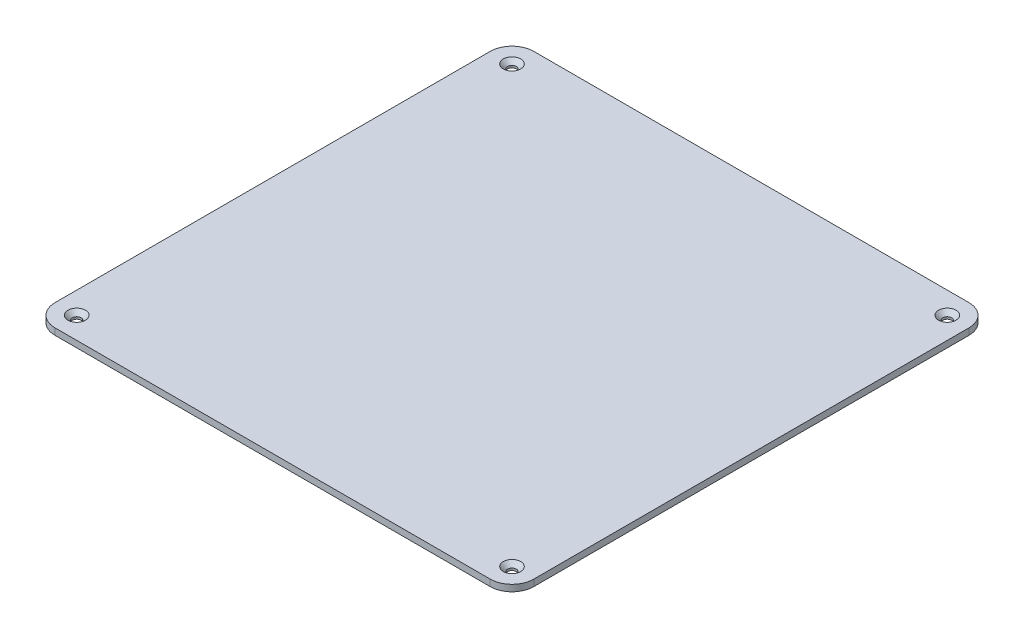
ISO-10303-21;
HEADER;
FILE_DESCRIPTION(('STEP AP214'),'2;1');
FILE_NAME('part.step','',(''),(''),'','','');
FILE_SCHEMA(('AUTOMOTIVE_DESIGN { 1 0 10303 214 1 1 1 1 }'));
ENDSEC;
DATA;
#1=APPLICATION_CONTEXT('core data for automotive mechanical design processes');
#2=APPLICATION_PROTOCOL_DEFINITION('international standard','automotive_design',2000,#1);
#3=PRODUCT_CONTEXT('',#1,'mechanical');
#4=PRODUCT('Part','Part','',(#3));
#5=PRODUCT_RELATED_PRODUCT_CATEGORY('part','',(#4));
#6=PRODUCT_DEFINITION_FORMATION('','',#4);
#7=PRODUCT_DEFINITION_CONTEXT('part definition',#1,'design');
#8=PRODUCT_DEFINITION('design','',#6,#7);
#9=PRODUCT_DEFINITION_SHAPE('','',#8);
#10=(LENGTH_UNIT() NAMED_UNIT(*) SI_UNIT(.MILLI.,.METRE.));
#11=(NAMED_UNIT(*) PLANE_ANGLE_UNIT() SI_UNIT($,.RADIAN.));
#12=(NAMED_UNIT(*) SI_UNIT($,.STERADIAN.) SOLID_ANGLE_UNIT());
#13=UNCERTAINTY_MEASURE_WITH_UNIT(LENGTH_MEASURE(1.E-05),#10,'distance_accuracy_value','');
#14=(GEOMETRIC_REPRESENTATION_CONTEXT(3) GLOBAL_UNCERTAINTY_ASSIGNED_CONTEXT((#13)) GLOBAL_UNIT_ASSIGNED_CONTEXT((#10,
#11,#12)) REPRESENTATION_CONTEXT('',''));
#15=CARTESIAN_POINT('',(0.,0.,0.));
#16=DIRECTION('',(0.,0.,1.));
#17=DIRECTION('',(1.,0.,0.));
#18=AXIS2_PLACEMENT_3D('',#15,#16,#17);
#19=CARTESIAN_POINT('',(0.,3.,0.));
#20=DIRECTION('',(-1.,0.,0.));
#21=DIRECTION('',(0.,0.,1.));
#22=AXIS2_PLACEMENT_3D('',#19,#20,#21);
#23=PLANE('',#22);
#24=DIRECTION('',(0.,0.,-1.));
#25=VECTOR('',#24,1.);
#26=CARTESIAN_POINT('',(0.,0.,0.));
#27=LINE('',#26,#25);
#28=CARTESIAN_POINT('',(0.,0.,-10.));
#29=VERTEX_POINT('',#28);
#30=CARTESIAN_POINT('',(0.,0.,-210.));
#31=VERTEX_POINT('',#30);
#32=EDGE_CURVE('E130',#29,#31,#27,.T.);
#33=ORIENTED_EDGE('',*,*,#32,.T.);
#34=DIRECTION('',(0.,-1.,0.));
#35=VECTOR('',#34,1.);
#36=CARTESIAN_POINT('',(0.,3.,-210.));
#37=LINE('',#36,#35);
#38=CARTESIAN_POINT('',(0.,3.,-210.));
#39=VERTEX_POINT('',#38);
#40=EDGE_CURVE('E108',#31,#39,#37,.F.);
#41=ORIENTED_EDGE('',*,*,#40,.T.);
#42=DIRECTION('',(0.,0.,-1.));
#43=VECTOR('',#42,1.);
#44=CARTESIAN_POINT('',(0.,3.,0.));
#45=LINE('',#44,#43);
#46=CARTESIAN_POINT('',(0.,3.,-10.));
#47=VERTEX_POINT('',#46);
#48=EDGE_CURVE('E140',#47,#39,#45,.T.);
#49=ORIENTED_EDGE('',*,*,#48,.F.);
#50=DIRECTION('',(0.,-1.,0.));
#51=VECTOR('',#50,1.);
#52=CARTESIAN_POINT('',(0.,3.,-10.));
#53=LINE('',#52,#51);
#54=EDGE_CURVE('E113',#47,#29,#53,.T.);
#55=ORIENTED_EDGE('',*,*,#54,.T.);
#56=EDGE_LOOP('',(#33,#41,#49,#55));
#57=FACE_BOUND('',#56,.T.);
#58=ADVANCED_FACE('F35',(#57),#23,.F.);
#59=CARTESIAN_POINT('',(0.,3.,-220.));
#60=DIRECTION('',(0.,0.,1.));
#61=DIRECTION('',(1.,0.,0.));
#62=AXIS2_PLACEMENT_3D('',#59,#60,#61);
#63=PLANE('',#62);
#64=DIRECTION('',(-1.,0.,0.));
#65=VECTOR('',#64,1.);
#66=CARTESIAN_POINT('',(0.,3.,-220.));
#67=LINE('',#66,#65);
#68=CARTESIAN_POINT('',(-10.,3.,-220.));
#69=VERTEX_POINT('',#68);
#70=CARTESIAN_POINT('',(-210.,3.,-220.));
#71=VERTEX_POINT('',#70);
#72=EDGE_CURVE('E123',#69,#71,#67,.T.);
#73=ORIENTED_EDGE('',*,*,#72,.F.);
#74=DIRECTION('',(0.,-1.,0.));
#75=VECTOR('',#74,1.);
#76=CARTESIAN_POINT('',(-10.,3.,-220.));
#77=LINE('',#76,#75);
#78=CARTESIAN_POINT('',(-10.,0.,-220.));
#79=VERTEX_POINT('',#78);
#80=EDGE_CURVE('E107',#69,#79,#77,.T.);
#81=ORIENTED_EDGE('',*,*,#80,.T.);
#82=DIRECTION('',(-1.,0.,0.));
#83=VECTOR('',#82,1.);
#84=CARTESIAN_POINT('',(0.,0.,-220.));
#85=LINE('',#84,#83);
#86=CARTESIAN_POINT('',(-210.,0.,-220.));
#87=VERTEX_POINT('',#86);
#88=EDGE_CURVE('E120',#79,#87,#85,.T.);
#89=ORIENTED_EDGE('',*,*,#88,.T.);
#90=DIRECTION('',(0.,-1.,0.));
#91=VECTOR('',#90,1.);
#92=CARTESIAN_POINT('',(-210.,3.,-220.));
#93=LINE('',#92,#91);
#94=EDGE_CURVE('E125',#87,#71,#93,.F.);
#95=ORIENTED_EDGE('',*,*,#94,.T.);
#96=EDGE_LOOP('',(#73,#81,#89,#95));
#97=FACE_BOUND('',#96,.T.);
#98=ADVANCED_FACE('F119',(#97),#63,.F.);
#99=CARTESIAN_POINT('',(-220.,3.,0.));
#100=DIRECTION('',(1.,0.,0.));
#101=DIRECTION('',(0.,0.,-1.));
#102=AXIS2_PLACEMENT_3D('',#99,#100,#101);
#103=PLANE('',#102);
#104=DIRECTION('',(0.,0.,1.));
#105=VECTOR('',#104,1.);
#106=CARTESIAN_POINT('',(-220.,0.,0.));
#107=LINE('',#106,#105);
#108=CARTESIAN_POINT('',(-220.,0.,-210.));
#109=VERTEX_POINT('',#108);
#110=CARTESIAN_POINT('',(-220.,0.,-10.));
#111=VERTEX_POINT('',#110);
#112=EDGE_CURVE('E129',#109,#111,#107,.T.);
#113=ORIENTED_EDGE('',*,*,#112,.T.);
#114=DIRECTION('',(0.,-1.,0.));
#115=VECTOR('',#114,1.);
#116=CARTESIAN_POINT('',(-220.,3.,-10.));
#117=LINE('',#116,#115);
#118=CARTESIAN_POINT('',(-220.,3.,-10.));
#119=VERTEX_POINT('',#118);
#120=EDGE_CURVE('E164',#111,#119,#117,.F.);
#121=ORIENTED_EDGE('',*,*,#120,.T.);
#122=DIRECTION('',(0.,0.,1.));
#123=VECTOR('',#122,1.);
#124=CARTESIAN_POINT('',(-220.,3.,0.));
#125=LINE('',#124,#123);
#126=CARTESIAN_POINT('',(-220.,3.,-210.));
#127=VERTEX_POINT('',#126);
#128=EDGE_CURVE('E270',#127,#119,#125,.T.);
#129=ORIENTED_EDGE('',*,*,#128,.F.);
#130=DIRECTION('',(0.,-1.,0.));
#131=VECTOR('',#130,1.);
#132=CARTESIAN_POINT('',(-220.,3.,-210.));
#133=LINE('',#132,#131);
#134=EDGE_CURVE('E161',#127,#109,#133,.T.);
#135=ORIENTED_EDGE('',*,*,#134,.T.);
#136=EDGE_LOOP('',(#113,#121,#129,#135));
#137=FACE_BOUND('',#136,.T.);
#138=ADVANCED_FACE('F209',(#137),#103,.F.);
#139=CARTESIAN_POINT('',(0.,3.,0.));
#140=DIRECTION('',(0.,0.,-1.));
#141=DIRECTION('',(-1.,0.,0.));
#142=AXIS2_PLACEMENT_3D('',#139,#140,#141);
#143=PLANE('',#142);
#144=DIRECTION('',(1.,0.,0.));
#145=VECTOR('',#144,1.);
#146=CARTESIAN_POINT('',(0.,0.,0.));
#147=LINE('',#146,#145);
#148=CARTESIAN_POINT('',(-210.,0.,0.));
#149=VERTEX_POINT('',#148);
#150=CARTESIAN_POINT('',(-10.,0.,0.));
#151=VERTEX_POINT('',#150);
#152=EDGE_CURVE('E133',#149,#151,#147,.T.);
#153=ORIENTED_EDGE('',*,*,#152,.T.);
#154=DIRECTION('',(0.,-1.,0.));
#155=VECTOR('',#154,1.);
#156=CARTESIAN_POINT('',(-10.,3.,0.));
#157=LINE('',#156,#155);
#158=CARTESIAN_POINT('',(-10.,3.,0.));
#159=VERTEX_POINT('',#158);
#160=EDGE_CURVE('E51',#151,#159,#157,.F.);
#161=ORIENTED_EDGE('',*,*,#160,.T.);
#162=DIRECTION('',(1.,0.,0.));
#163=VECTOR('',#162,1.);
#164=CARTESIAN_POINT('',(0.,3.,0.));
#165=LINE('',#164,#163);
#166=CARTESIAN_POINT('',(-210.,3.,0.));
#167=VERTEX_POINT('',#166);
#168=EDGE_CURVE('E141',#167,#159,#165,.T.);
#169=ORIENTED_EDGE('',*,*,#168,.F.);
#170=DIRECTION('',(0.,-1.,0.));
#171=VECTOR('',#170,1.);
#172=CARTESIAN_POINT('',(-210.,3.,0.));
#173=LINE('',#172,#171);
#174=EDGE_CURVE('E157',#167,#149,#173,.T.);
#175=ORIENTED_EDGE('',*,*,#174,.T.);
#176=EDGE_LOOP('',(#153,#161,#169,#175));
#177=FACE_BOUND('',#176,.T.);
#178=ADVANCED_FACE('F277',(#177),#143,.F.);
#179=CARTESIAN_POINT('',(0.,3.,0.));
#180=DIRECTION('',(0.,1.,0.));
#181=DIRECTION('',(0.,0.,1.));
#182=AXIS2_PLACEMENT_3D('',#179,#180,#181);
#183=PLANE('',#182);
#184=CARTESIAN_POINT('',(-210.,3.,-10.));
#185=DIRECTION('',(0.,1.,0.));
#186=DIRECTION('',(0.,0.,1.));
#187=AXIS2_PLACEMENT_3D('',#184,#185,#186);
#188=CIRCLE('',#187,4.00000000000003);
#189=CARTESIAN_POINT('',(-210.,3.,-5.99999999999997));
#190=VERTEX_POINT('',#189);
#191=EDGE_CURVE('E178',#190,#190,#188,.F.);
#192=ORIENTED_EDGE('',*,*,#191,.T.);
#193=EDGE_LOOP('',(#192));
#194=FACE_BOUND('',#193,.T.);
#195=CARTESIAN_POINT('',(-10.0000000000001,3.,-9.99999999999995));
#196=DIRECTION('',(0.,1.,0.));
#197=DIRECTION('',(0.,0.,1.));
#198=AXIS2_PLACEMENT_3D('',#195,#196,#197);
#199=CIRCLE('',#198,4.00000000000003);
#200=CARTESIAN_POINT('',(-10.0000000000001,3.,-5.99999999999991));
#201=VERTEX_POINT('',#200);
#202=EDGE_CURVE('E175',#201,#201,#199,.F.);
#203=ORIENTED_EDGE('',*,*,#202,.T.);
#204=EDGE_LOOP('',(#203));
#205=FACE_BOUND('',#204,.T.);
#206=CARTESIAN_POINT('',(-9.99999999999993,3.,-210.));
#207=DIRECTION('',(0.,1.,0.));
#208=DIRECTION('',(0.,0.,1.));
#209=AXIS2_PLACEMENT_3D('',#206,#207,#208);
#210=CIRCLE('',#209,4.00000000000003);
#211=CARTESIAN_POINT('',(-9.99999999999993,3.,-206.));
#212=VERTEX_POINT('',#211);
#213=EDGE_CURVE('E172',#212,#212,#210,.F.);
#214=ORIENTED_EDGE('',*,*,#213,.T.);
#215=EDGE_LOOP('',(#214));
#216=FACE_BOUND('',#215,.T.);
#217=CARTESIAN_POINT('',(-210.,3.,-210.));
#218=DIRECTION('',(0.,1.,0.));
#219=DIRECTION('',(0.,0.,1.));
#220=AXIS2_PLACEMENT_3D('',#217,#218,#219);
#221=CIRCLE('',#220,4.00000000000003);
#222=CARTESIAN_POINT('',(-210.,3.,-206.));
#223=VERTEX_POINT('',#222);
#224=EDGE_CURVE('E169',#223,#223,#221,.F.);
#225=ORIENTED_EDGE('',*,*,#224,.T.);
#226=EDGE_LOOP('',(#225));
#227=FACE_BOUND('',#226,.T.);
#228=ORIENTED_EDGE('',*,*,#48,.T.);
#229=CARTESIAN_POINT('',(-10.,3.,-210.));
#230=DIRECTION('',(0.,1.,0.));
#231=DIRECTION('',(0.,0.,1.));
#232=AXIS2_PLACEMENT_3D('',#229,#230,#231);
#233=CIRCLE('',#232,10.);
#234=EDGE_CURVE('E155',#39,#69,#233,.T.);
#235=ORIENTED_EDGE('',*,*,#234,.T.);
#236=ORIENTED_EDGE('',*,*,#72,.T.);
#237=CARTESIAN_POINT('',(-210.,3.,-210.));
#238=DIRECTION('',(0.,1.,0.));
#239=DIRECTION('',(0.,0.,1.));
#240=AXIS2_PLACEMENT_3D('',#237,#238,#239);
#241=CIRCLE('',#240,10.);
#242=EDGE_CURVE('E150',#71,#127,#241,.T.);
#243=ORIENTED_EDGE('',*,*,#242,.T.);
#244=ORIENTED_EDGE('',*,*,#128,.T.);
#245=CARTESIAN_POINT('',(-210.,3.,-10.));
#246=DIRECTION('',(0.,1.,0.));
#247=DIRECTION('',(0.,0.,1.));
#248=AXIS2_PLACEMENT_3D('',#245,#246,#247);
#249=CIRCLE('',#248,10.);
#250=EDGE_CURVE('E58',#119,#167,#249,.T.);
#251=ORIENTED_EDGE('',*,*,#250,.T.);
#252=ORIENTED_EDGE('',*,*,#168,.T.);
#253=CARTESIAN_POINT('',(-10.,3.,-10.));
#254=DIRECTION('',(0.,1.,0.));
#255=DIRECTION('',(0.,0.,1.));
#256=AXIS2_PLACEMENT_3D('',#253,#254,#255);
#257=CIRCLE('',#256,10.);
#258=EDGE_CURVE('E153',#159,#47,#257,.T.);
#259=ORIENTED_EDGE('',*,*,#258,.T.);
#260=EDGE_LOOP('',(#228,#235,#236,#243,#244,#251,#252,#259));
#261=FACE_BOUND('',#260,.T.);
#262=ADVANCED_FACE('F272',(#194,#205,#216,#227,#261),#183,.T.);
#263=CARTESIAN_POINT('',(0.,0.,0.));
#264=DIRECTION('',(0.,1.,0.));
#265=DIRECTION('',(0.,0.,1.));
#266=AXIS2_PLACEMENT_3D('',#263,#264,#265);
#267=PLANE('',#266);
#268=CARTESIAN_POINT('',(-9.99999999999993,0.,-210.));
#269=DIRECTION('',(0.,1.,0.));
#270=DIRECTION('',(0.,0.,-1.));
#271=AXIS2_PLACEMENT_3D('',#268,#269,#270);
#272=CIRCLE('',#271,2.);
#273=CARTESIAN_POINT('',(-9.99999999999993,0.,-212.));
#274=VERTEX_POINT('',#273);
#275=EDGE_CURVE('E262',#274,#274,#272,.T.);
#276=ORIENTED_EDGE('',*,*,#275,.T.);
#277=EDGE_LOOP('',(#276));
#278=FACE_BOUND('',#277,.T.);
#279=CARTESIAN_POINT('',(-10.0000000000001,0.,-9.99999999999995));
#280=DIRECTION('',(0.,1.,0.));
#281=DIRECTION('',(0.,0.,-1.));
#282=AXIS2_PLACEMENT_3D('',#279,#280,#281);
#283=CIRCLE('',#282,2.);
#284=CARTESIAN_POINT('',(-10.0000000000001,0.,-11.9999999999999));
#285=VERTEX_POINT('',#284);
#286=EDGE_CURVE('E257',#285,#285,#283,.T.);
#287=ORIENTED_EDGE('',*,*,#286,.T.);
#288=EDGE_LOOP('',(#287));
#289=FACE_BOUND('',#288,.T.);
#290=CARTESIAN_POINT('',(-210.,0.,-10.));
#291=DIRECTION('',(0.,1.,0.));
#292=DIRECTION('',(0.,0.,1.));
#293=AXIS2_PLACEMENT_3D('',#290,#291,#292);
#294=CIRCLE('',#293,2.);
#295=CARTESIAN_POINT('',(-210.,0.,-8.00000000000001));
#296=VERTEX_POINT('',#295);
#297=EDGE_CURVE('E255',#296,#296,#294,.T.);
#298=ORIENTED_EDGE('',*,*,#297,.T.);
#299=EDGE_LOOP('',(#298));
#300=FACE_BOUND('',#299,.T.);
#301=CARTESIAN_POINT('',(-210.,0.,-210.));
#302=DIRECTION('',(0.,1.,0.));
#303=DIRECTION('',(0.,0.,1.));
#304=AXIS2_PLACEMENT_3D('',#301,#302,#303);
#305=CIRCLE('',#304,2.);
#306=CARTESIAN_POINT('',(-210.,0.,-208.));
#307=VERTEX_POINT('',#306);
#308=EDGE_CURVE('E135',#307,#307,#305,.T.);
#309=ORIENTED_EDGE('',*,*,#308,.T.);
#310=EDGE_LOOP('',(#309));
#311=FACE_BOUND('',#310,.T.);
#312=ORIENTED_EDGE('',*,*,#88,.F.);
#313=CARTESIAN_POINT('',(-10.,0.,-210.));
#314=DIRECTION('',(0.,1.,0.));
#315=DIRECTION('',(0.,0.,1.));
#316=AXIS2_PLACEMENT_3D('',#313,#314,#315);
#317=CIRCLE('',#316,10.);
#318=EDGE_CURVE('E103',#79,#31,#317,.F.);
#319=ORIENTED_EDGE('',*,*,#318,.T.);
#320=ORIENTED_EDGE('',*,*,#32,.F.);
#321=CARTESIAN_POINT('',(-10.,0.,-10.));
#322=DIRECTION('',(0.,1.,0.));
#323=DIRECTION('',(0.,0.,1.));
#324=AXIS2_PLACEMENT_3D('',#321,#322,#323);
#325=CIRCLE('',#324,10.);
#326=EDGE_CURVE('E114',#29,#151,#325,.F.);
#327=ORIENTED_EDGE('',*,*,#326,.T.);
#328=ORIENTED_EDGE('',*,*,#152,.F.);
#329=CARTESIAN_POINT('',(-210.,0.,-10.));
#330=DIRECTION('',(0.,1.,0.));
#331=DIRECTION('',(0.,0.,1.));
#332=AXIS2_PLACEMENT_3D('',#329,#330,#331);
#333=CIRCLE('',#332,10.);
#334=EDGE_CURVE('E144',#149,#111,#333,.F.);
#335=ORIENTED_EDGE('',*,*,#334,.T.);
#336=ORIENTED_EDGE('',*,*,#112,.F.);
#337=CARTESIAN_POINT('',(-210.,0.,-210.));
#338=DIRECTION('',(0.,1.,0.));
#339=DIRECTION('',(0.,0.,1.));
#340=AXIS2_PLACEMENT_3D('',#337,#338,#339);
#341=CIRCLE('',#340,10.);
#342=EDGE_CURVE('E124',#109,#87,#341,.F.);
#343=ORIENTED_EDGE('',*,*,#342,.T.);
#344=EDGE_LOOP('',(#312,#319,#320,#327,#328,#335,#336,#343));
#345=FACE_BOUND('',#344,.T.);
#346=ADVANCED_FACE('F127',(#278,#289,#300,#311,#345),#267,.F.);
#347=CARTESIAN_POINT('',(-10.,3.,-210.));
#348=DIRECTION('',(0.,-1.,0.));
#349=DIRECTION('',(0.,0.,-1.));
#350=AXIS2_PLACEMENT_3D('',#347,#348,#349);
#351=CYLINDRICAL_SURFACE('',#350,10.);
#352=ORIENTED_EDGE('',*,*,#234,.F.);
#353=ORIENTED_EDGE('',*,*,#40,.F.);
#354=ORIENTED_EDGE('',*,*,#318,.F.);
#355=ORIENTED_EDGE('',*,*,#80,.F.);
#356=EDGE_LOOP('',(#352,#353,#354,#355));
#357=FACE_BOUND('',#356,.T.);
#358=ADVANCED_FACE('F106',(#357),#351,.T.);
#359=CARTESIAN_POINT('',(-10.,3.,-10.));
#360=DIRECTION('',(0.,-1.,0.));
#361=DIRECTION('',(0.,0.,-1.));
#362=AXIS2_PLACEMENT_3D('',#359,#360,#361);
#363=CYLINDRICAL_SURFACE('',#362,10.);
#364=ORIENTED_EDGE('',*,*,#258,.F.);
#365=ORIENTED_EDGE('',*,*,#160,.F.);
#366=ORIENTED_EDGE('',*,*,#326,.F.);
#367=ORIENTED_EDGE('',*,*,#54,.F.);
#368=EDGE_LOOP('',(#364,#365,#366,#367));
#369=FACE_BOUND('',#368,.T.);
#370=ADVANCED_FACE('F215',(#369),#363,.T.);
#371=CARTESIAN_POINT('',(-210.,3.,-10.));
#372=DIRECTION('',(0.,-1.,0.));
#373=DIRECTION('',(0.,0.,-1.));
#374=AXIS2_PLACEMENT_3D('',#371,#372,#373);
#375=CYLINDRICAL_SURFACE('',#374,10.);
#376=ORIENTED_EDGE('',*,*,#250,.F.);
#377=ORIENTED_EDGE('',*,*,#120,.F.);
#378=ORIENTED_EDGE('',*,*,#334,.F.);
#379=ORIENTED_EDGE('',*,*,#174,.F.);
#380=EDGE_LOOP('',(#376,#377,#378,#379));
#381=FACE_BOUND('',#380,.T.);
#382=ADVANCED_FACE('F218',(#381),#375,.T.);
#383=CARTESIAN_POINT('',(-210.,3.,-210.));
#384=DIRECTION('',(0.,-1.,0.));
#385=DIRECTION('',(0.,0.,-1.));
#386=AXIS2_PLACEMENT_3D('',#383,#384,#385);
#387=CYLINDRICAL_SURFACE('',#386,10.);
#388=ORIENTED_EDGE('',*,*,#242,.F.);
#389=ORIENTED_EDGE('',*,*,#94,.F.);
#390=ORIENTED_EDGE('',*,*,#342,.F.);
#391=ORIENTED_EDGE('',*,*,#134,.F.);
#392=EDGE_LOOP('',(#388,#389,#390,#391));
#393=FACE_BOUND('',#392,.T.);
#394=ADVANCED_FACE('F222',(#393),#387,.T.);
#395=CARTESIAN_POINT('',(-210.,0.,-210.));
#396=DIRECTION('',(0.,1.,0.));
#397=DIRECTION('',(0.,0.,1.));
#398=AXIS2_PLACEMENT_3D('',#395,#396,#397);
#399=CYLINDRICAL_SURFACE('',#398,2.);
#400=CARTESIAN_POINT('',(-210.,0.999999999999986,-210.));
#401=DIRECTION('',(0.,1.,0.));
#402=DIRECTION('',(0.,0.,1.));
#403=AXIS2_PLACEMENT_3D('',#400,#401,#402);
#404=CIRCLE('',#403,2.);
#405=CARTESIAN_POINT('',(-210.,0.999999999999986,-208.));
#406=VERTEX_POINT('',#405);
#407=EDGE_CURVE('E11',#406,#406,#404,.T.);
#408=ORIENTED_EDGE('',*,*,#407,.T.);
#409=EDGE_LOOP('',(#408));
#410=FACE_BOUND('',#409,.T.);
#411=ORIENTED_EDGE('',*,*,#308,.F.);
#412=EDGE_LOOP('',(#411));
#413=FACE_BOUND('',#412,.T.);
#414=ADVANCED_FACE('F226',(#410,#413),#399,.F.);
#415=CARTESIAN_POINT('',(-210.,0.,-10.));
#416=DIRECTION('',(0.,1.,0.));
#417=DIRECTION('',(0.,0.,1.));
#418=AXIS2_PLACEMENT_3D('',#415,#416,#417);
#419=CYLINDRICAL_SURFACE('',#418,2.);
#420=CARTESIAN_POINT('',(-210.,0.999999999999986,-10.));
#421=DIRECTION('',(0.,1.,0.));
#422=DIRECTION('',(0.,0.,1.));
#423=AXIS2_PLACEMENT_3D('',#420,#421,#422);
#424=CIRCLE('',#423,2.);
#425=CARTESIAN_POINT('',(-210.,0.999999999999986,-8.00000000000001));
#426=VERTEX_POINT('',#425);
#427=EDGE_CURVE('E166',#426,#426,#424,.T.);
#428=ORIENTED_EDGE('',*,*,#427,.T.);
#429=EDGE_LOOP('',(#428));
#430=FACE_BOUND('',#429,.T.);
#431=ORIENTED_EDGE('',*,*,#297,.F.);
#432=EDGE_LOOP('',(#431));
#433=FACE_BOUND('',#432,.T.);
#434=ADVANCED_FACE('F249',(#430,#433),#419,.F.);
#435=CARTESIAN_POINT('',(-10.0000000000001,0.,-9.99999999999995));
#436=DIRECTION('',(0.,1.,0.));
#437=DIRECTION('',(0.,0.,1.));
#438=AXIS2_PLACEMENT_3D('',#435,#436,#437);
#439=CYLINDRICAL_SURFACE('',#438,2.);
#440=CARTESIAN_POINT('',(-10.0000000000001,0.999999999999986,-9.99999999999995));
#441=DIRECTION('',(0.,1.,0.));
#442=DIRECTION('',(0.,0.,1.));
#443=AXIS2_PLACEMENT_3D('',#440,#441,#442);
#444=CIRCLE('',#443,2.);
#445=CARTESIAN_POINT('',(-10.0000000000001,0.999999999999986,-7.99999999999995));
#446=VERTEX_POINT('',#445);
#447=EDGE_CURVE('E181',#446,#446,#444,.T.);
#448=ORIENTED_EDGE('',*,*,#447,.T.);
#449=EDGE_LOOP('',(#448));
#450=FACE_BOUND('',#449,.T.);
#451=ORIENTED_EDGE('',*,*,#286,.F.);
#452=EDGE_LOOP('',(#451));
#453=FACE_BOUND('',#452,.T.);
#454=ADVANCED_FACE('F243',(#450,#453),#439,.F.);
#455=CARTESIAN_POINT('',(-9.99999999999993,0.,-210.));
#456=DIRECTION('',(0.,1.,0.));
#457=DIRECTION('',(0.,0.,1.));
#458=AXIS2_PLACEMENT_3D('',#455,#456,#457);
#459=CYLINDRICAL_SURFACE('',#458,2.);
#460=CARTESIAN_POINT('',(-9.99999999999993,0.999999999999986,-210.));
#461=DIRECTION('',(0.,1.,0.));
#462=DIRECTION('',(0.,0.,1.));
#463=AXIS2_PLACEMENT_3D('',#460,#461,#462);
#464=CIRCLE('',#463,2.);
#465=CARTESIAN_POINT('',(-9.99999999999993,0.999999999999986,-208.));
#466=VERTEX_POINT('',#465);
#467=EDGE_CURVE('E44',#466,#466,#464,.T.);
#468=ORIENTED_EDGE('',*,*,#467,.T.);
#469=EDGE_LOOP('',(#468));
#470=FACE_BOUND('',#469,.T.);
#471=ORIENTED_EDGE('',*,*,#275,.F.);
#472=EDGE_LOOP('',(#471));
#473=FACE_BOUND('',#472,.T.);
#474=ADVANCED_FACE('F186',(#470,#473),#459,.F.);
#475=CARTESIAN_POINT('',(-210.,0.999999999999986,-10.));
#476=DIRECTION('',(0.,1.,0.));
#477=DIRECTION('',(0.,0.,1.));
#478=AXIS2_PLACEMENT_3D('',#475,#476,#477);
#479=CONICAL_SURFACE('',#478,2.,0.785398163397454);
#480=ORIENTED_EDGE('',*,*,#191,.F.);
#481=EDGE_LOOP('',(#480));
#482=FACE_BOUND('',#481,.T.);
#483=ORIENTED_EDGE('',*,*,#427,.F.);
#484=EDGE_LOOP('',(#483));
#485=FACE_BOUND('',#484,.T.);
#486=ADVANCED_FACE('F198',(#482,#485),#479,.F.);
#487=CARTESIAN_POINT('',(-10.0000000000001,0.999999999999986,-9.99999999999995));
#488=DIRECTION('',(0.,1.,0.));
#489=DIRECTION('',(0.,0.,1.));
#490=AXIS2_PLACEMENT_3D('',#487,#488,#489);
#491=CONICAL_SURFACE('',#490,2.,0.785398163397454);
#492=ORIENTED_EDGE('',*,*,#202,.F.);
#493=EDGE_LOOP('',(#492));
#494=FACE_BOUND('',#493,.T.);
#495=ORIENTED_EDGE('',*,*,#447,.F.);
#496=EDGE_LOOP('',(#495));
#497=FACE_BOUND('',#496,.T.);
#498=ADVANCED_FACE('F191',(#494,#497),#491,.F.);
#499=CARTESIAN_POINT('',(-9.99999999999993,0.999999999999986,-210.));
#500=DIRECTION('',(0.,1.,0.));
#501=DIRECTION('',(0.,0.,1.));
#502=AXIS2_PLACEMENT_3D('',#499,#500,#501);
#503=CONICAL_SURFACE('',#502,2.,0.785398163397453);
#504=ORIENTED_EDGE('',*,*,#213,.F.);
#505=EDGE_LOOP('',(#504));
#506=FACE_BOUND('',#505,.T.);
#507=ORIENTED_EDGE('',*,*,#467,.F.);
#508=EDGE_LOOP('',(#507));
#509=FACE_BOUND('',#508,.T.);
#510=ADVANCED_FACE('F189',(#506,#509),#503,.F.);
#511=CARTESIAN_POINT('',(-210.,0.999999999999986,-210.));
#512=DIRECTION('',(0.,1.,0.));
#513=DIRECTION('',(0.,0.,1.));
#514=AXIS2_PLACEMENT_3D('',#511,#512,#513);
#515=CONICAL_SURFACE('',#514,2.,0.785398163397453);
#516=ORIENTED_EDGE('',*,*,#224,.F.);
#517=EDGE_LOOP('',(#516));
#518=FACE_BOUND('',#517,.T.);
#519=ORIENTED_EDGE('',*,*,#407,.F.);
#520=EDGE_LOOP('',(#519));
#521=FACE_BOUND('',#520,.T.);
#522=ADVANCED_FACE('F38',(#518,#521),#515,.F.);
#523=CLOSED_SHELL('',(#58,#98,#138,#178,#262,#346,#358,#370,#382,#394,#414,#434,#454,#474,#486,
#498,#510,#522));
#524=MANIFOLD_SOLID_BREP('B2',#523);
#525=ADVANCED_BREP_SHAPE_REPRESENTATION('',(#18,#524),#14);
#526=SHAPE_DEFINITION_REPRESENTATION(#9,#525);
ENDSEC;
END-ISO-10303-21;
